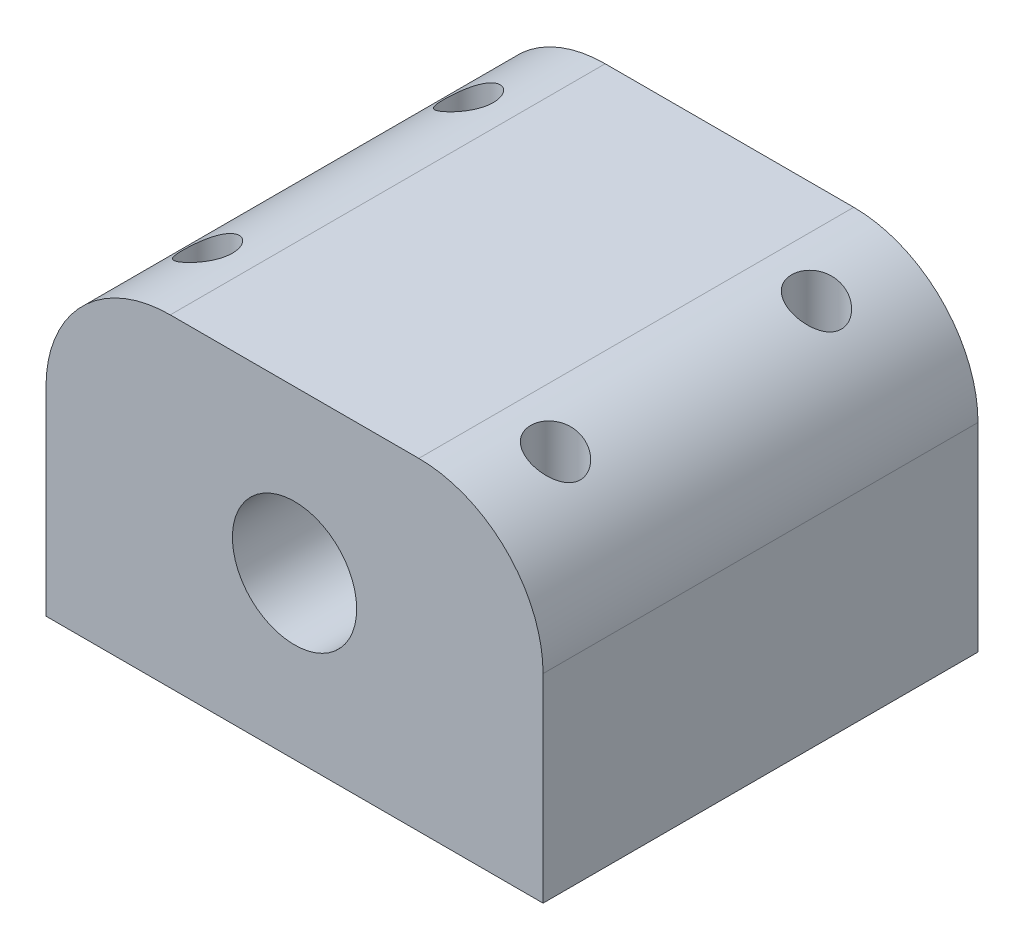
ISO-10303-21;
HEADER;
FILE_DESCRIPTION(('STEP AP214'),'2;1');
FILE_NAME('part.step','',(''),(''),'','','');
FILE_SCHEMA(('AUTOMOTIVE_DESIGN { 1 0 10303 214 1 1 1 1 }'));
ENDSEC;
DATA;
#1=APPLICATION_CONTEXT('core data for automotive mechanical design processes');
#2=APPLICATION_PROTOCOL_DEFINITION('international standard','automotive_design',2000,#1);
#3=PRODUCT_CONTEXT('',#1,'mechanical');
#4=PRODUCT('Part','Part','',(#3));
#5=PRODUCT_RELATED_PRODUCT_CATEGORY('part','',(#4));
#6=PRODUCT_DEFINITION_FORMATION('','',#4);
#7=PRODUCT_DEFINITION_CONTEXT('part definition',#1,'design');
#8=PRODUCT_DEFINITION('design','',#6,#7);
#9=PRODUCT_DEFINITION_SHAPE('','',#8);
#10=(LENGTH_UNIT() NAMED_UNIT(*) SI_UNIT(.MILLI.,.METRE.));
#11=(NAMED_UNIT(*) PLANE_ANGLE_UNIT() SI_UNIT($,.RADIAN.));
#12=(NAMED_UNIT(*) SI_UNIT($,.STERADIAN.) SOLID_ANGLE_UNIT());
#13=UNCERTAINTY_MEASURE_WITH_UNIT(LENGTH_MEASURE(1.E-05),#10,'distance_accuracy_value','');
#14=(GEOMETRIC_REPRESENTATION_CONTEXT(3) GLOBAL_UNCERTAINTY_ASSIGNED_CONTEXT((#13)) GLOBAL_UNIT_ASSIGNED_CONTEXT((#10,
#11,#12)) REPRESENTATION_CONTEXT('',''));
#15=CARTESIAN_POINT('',(0.,0.,0.));
#16=DIRECTION('',(0.,0.,1.));
#17=DIRECTION('',(1.,0.,0.));
#18=AXIS2_PLACEMENT_3D('',#15,#16,#17);
#19=CARTESIAN_POINT('',(30.325,21.8,35.));
#20=DIRECTION('',(1.,0.,0.));
#21=DIRECTION('',(0.,1.,0.));
#22=AXIS2_PLACEMENT_3D('',#19,#20,#21);
#23=PLANE('',#22);
#24=DIRECTION('',(0.,-1.,0.));
#25=VECTOR('',#24,1.);
#26=CARTESIAN_POINT('',(30.325,21.8,0.));
#27=LINE('',#26,#25);
#28=CARTESIAN_POINT('',(30.325,11.8,0.));
#29=VERTEX_POINT('',#28);
#30=CARTESIAN_POINT('',(30.325,-4.19999999999999,0.));
#31=VERTEX_POINT('',#30);
#32=EDGE_CURVE('E119',#29,#31,#27,.T.);
#33=ORIENTED_EDGE('',*,*,#32,.F.);
#34=DIRECTION('',(0.,0.,-1.));
#35=VECTOR('',#34,1.);
#36=CARTESIAN_POINT('',(30.325,11.8,35.));
#37=LINE('',#36,#35);
#38=CARTESIAN_POINT('',(30.325,11.8,35.));
#39=VERTEX_POINT('',#38);
#40=EDGE_CURVE('E11',#29,#39,#37,.F.);
#41=ORIENTED_EDGE('',*,*,#40,.T.);
#42=DIRECTION('',(0.,-1.,0.));
#43=VECTOR('',#42,1.);
#44=CARTESIAN_POINT('',(30.325,21.8,35.));
#45=LINE('',#44,#43);
#46=CARTESIAN_POINT('',(30.325,-4.19999999999999,35.));
#47=VERTEX_POINT('',#46);
#48=EDGE_CURVE('E91',#39,#47,#45,.T.);
#49=ORIENTED_EDGE('',*,*,#48,.T.);
#50=DIRECTION('',(0.,0.,-1.));
#51=VECTOR('',#50,1.);
#52=CARTESIAN_POINT('',(30.325,-4.19999999999999,35.));
#53=LINE('',#52,#51);
#54=EDGE_CURVE('E93',#47,#31,#53,.T.);
#55=ORIENTED_EDGE('',*,*,#54,.T.);
#56=EDGE_LOOP('',(#33,#41,#49,#55));
#57=FACE_BOUND('',#56,.T.);
#58=ADVANCED_FACE('F32',(#57),#23,.T.);
#59=CARTESIAN_POINT('',(30.325,21.8,35.));
#60=DIRECTION('',(0.,-1.,0.));
#61=DIRECTION('',(1.,0.,0.));
#62=AXIS2_PLACEMENT_3D('',#59,#60,#61);
#63=PLANE('',#62);
#64=DIRECTION('',(-1.,0.,0.));
#65=VECTOR('',#64,1.);
#66=CARTESIAN_POINT('',(30.325,21.8,0.));
#67=LINE('',#66,#65);
#68=CARTESIAN_POINT('',(20.325,21.8,0.));
#69=VERTEX_POINT('',#68);
#70=CARTESIAN_POINT('',(0.324999999999999,21.8,0.));
#71=VERTEX_POINT('',#70);
#72=EDGE_CURVE('E99',#69,#71,#67,.T.);
#73=ORIENTED_EDGE('',*,*,#72,.T.);
#74=DIRECTION('',(0.,0.,-1.));
#75=VECTOR('',#74,1.);
#76=CARTESIAN_POINT('',(0.324999999999999,21.8,35.));
#77=LINE('',#76,#75);
#78=CARTESIAN_POINT('',(0.324999999999999,21.8,35.));
#79=VERTEX_POINT('',#78);
#80=EDGE_CURVE('E60',#71,#79,#77,.F.);
#81=ORIENTED_EDGE('',*,*,#80,.T.);
#82=DIRECTION('',(-1.,0.,0.));
#83=VECTOR('',#82,1.);
#84=CARTESIAN_POINT('',(30.325,21.8,35.));
#85=LINE('',#84,#83);
#86=CARTESIAN_POINT('',(20.325,21.8,35.));
#87=VERTEX_POINT('',#86);
#88=EDGE_CURVE('E108',#87,#79,#85,.T.);
#89=ORIENTED_EDGE('',*,*,#88,.F.);
#90=DIRECTION('',(0.,0.,-1.));
#91=VECTOR('',#90,1.);
#92=CARTESIAN_POINT('',(20.325,21.8,0.));
#93=LINE('',#92,#91);
#94=EDGE_CURVE('E137',#87,#69,#93,.T.);
#95=ORIENTED_EDGE('',*,*,#94,.T.);
#96=EDGE_LOOP('',(#73,#81,#89,#95));
#97=FACE_BOUND('',#96,.T.);
#98=ADVANCED_FACE('F178',(#97),#63,.F.);
#99=CARTESIAN_POINT('',(-9.675,21.8,35.));
#100=DIRECTION('',(1.,0.,0.));
#101=DIRECTION('',(0.,0.,-1.));
#102=AXIS2_PLACEMENT_3D('',#99,#100,#101);
#103=PLANE('',#102);
#104=DIRECTION('',(0.,-1.,0.));
#105=VECTOR('',#104,1.);
#106=CARTESIAN_POINT('',(-9.675,21.8,35.));
#107=LINE('',#106,#105);
#108=CARTESIAN_POINT('',(-9.675,11.8,35.));
#109=VERTEX_POINT('',#108);
#110=CARTESIAN_POINT('',(-9.675,-4.2,35.));
#111=VERTEX_POINT('',#110);
#112=EDGE_CURVE('E112',#109,#111,#107,.T.);
#113=ORIENTED_EDGE('',*,*,#112,.F.);
#114=DIRECTION('',(0.,0.,-1.));
#115=VECTOR('',#114,1.);
#116=CARTESIAN_POINT('',(-9.675,11.8,35.));
#117=LINE('',#116,#115);
#118=CARTESIAN_POINT('',(-9.675,11.8,0.));
#119=VERTEX_POINT('',#118);
#120=EDGE_CURVE('E126',#109,#119,#117,.T.);
#121=ORIENTED_EDGE('',*,*,#120,.T.);
#122=DIRECTION('',(0.,-1.,0.));
#123=VECTOR('',#122,1.);
#124=CARTESIAN_POINT('',(-9.675,21.8,0.));
#125=LINE('',#124,#123);
#126=CARTESIAN_POINT('',(-9.675,-4.2,0.));
#127=VERTEX_POINT('',#126);
#128=EDGE_CURVE('E123',#119,#127,#125,.T.);
#129=ORIENTED_EDGE('',*,*,#128,.T.);
#130=DIRECTION('',(0.,0.,-1.));
#131=VECTOR('',#130,1.);
#132=CARTESIAN_POINT('',(-9.675,-4.2,35.));
#133=LINE('',#132,#131);
#134=EDGE_CURVE('E107',#111,#127,#133,.T.);
#135=ORIENTED_EDGE('',*,*,#134,.F.);
#136=EDGE_LOOP('',(#113,#121,#129,#135));
#137=FACE_BOUND('',#136,.T.);
#138=ADVANCED_FACE('F181',(#137),#103,.F.);
#139=CARTESIAN_POINT('',(30.325,-4.19999999999999,35.));
#140=DIRECTION('',(0.,-1.,0.));
#141=DIRECTION('',(1.,0.,0.));
#142=AXIS2_PLACEMENT_3D('',#139,#140,#141);
#143=PLANE('',#142);
#144=CARTESIAN_POINT('',(24.325,-4.2,7.));
#145=DIRECTION('',(0.,1.,0.));
#146=DIRECTION('',(-1.,0.,0.));
#147=AXIS2_PLACEMENT_3D('',#144,#145,#146);
#148=CIRCLE('',#147,2.);
#149=CARTESIAN_POINT('',(22.325,-4.2,7.));
#150=VERTEX_POINT('',#149);
#151=EDGE_CURVE('E290',#150,#150,#148,.T.);
#152=ORIENTED_EDGE('',*,*,#151,.T.);
#153=EDGE_LOOP('',(#152));
#154=FACE_BOUND('',#153,.T.);
#155=CARTESIAN_POINT('',(-3.675,-4.2,28.));
#156=DIRECTION('',(0.,1.,0.));
#157=DIRECTION('',(-1.,0.,0.));
#158=AXIS2_PLACEMENT_3D('',#155,#156,#157);
#159=CIRCLE('',#158,2.);
#160=CARTESIAN_POINT('',(-5.675,-4.2,28.));
#161=VERTEX_POINT('',#160);
#162=EDGE_CURVE('E293',#161,#161,#159,.T.);
#163=ORIENTED_EDGE('',*,*,#162,.T.);
#164=EDGE_LOOP('',(#163));
#165=FACE_BOUND('',#164,.T.);
#166=CARTESIAN_POINT('',(24.325,-4.2,28.));
#167=DIRECTION('',(0.,1.,0.));
#168=DIRECTION('',(-1.,0.,0.));
#169=AXIS2_PLACEMENT_3D('',#166,#167,#168);
#170=CIRCLE('',#169,2.);
#171=CARTESIAN_POINT('',(22.325,-4.2,28.));
#172=VERTEX_POINT('',#171);
#173=EDGE_CURVE('E297',#172,#172,#170,.T.);
#174=ORIENTED_EDGE('',*,*,#173,.T.);
#175=EDGE_LOOP('',(#174));
#176=FACE_BOUND('',#175,.T.);
#177=CARTESIAN_POINT('',(-3.675,-4.2,7.));
#178=DIRECTION('',(0.,1.,0.));
#179=DIRECTION('',(-1.,0.,0.));
#180=AXIS2_PLACEMENT_3D('',#177,#178,#179);
#181=CIRCLE('',#180,2.);
#182=CARTESIAN_POINT('',(-5.675,-4.2,7.));
#183=VERTEX_POINT('',#182);
#184=EDGE_CURVE('E151',#183,#183,#181,.T.);
#185=ORIENTED_EDGE('',*,*,#184,.T.);
#186=EDGE_LOOP('',(#185));
#187=FACE_BOUND('',#186,.T.);
#188=DIRECTION('',(-1.,0.,0.));
#189=VECTOR('',#188,1.);
#190=CARTESIAN_POINT('',(30.325,-4.19999999999999,0.));
#191=LINE('',#190,#189);
#192=EDGE_CURVE('E106',#31,#127,#191,.T.);
#193=ORIENTED_EDGE('',*,*,#192,.F.);
#194=ORIENTED_EDGE('',*,*,#54,.F.);
#195=DIRECTION('',(-1.,0.,0.));
#196=VECTOR('',#195,1.);
#197=CARTESIAN_POINT('',(30.325,-4.19999999999999,35.));
#198=LINE('',#197,#196);
#199=EDGE_CURVE('E98',#47,#111,#198,.T.);
#200=ORIENTED_EDGE('',*,*,#199,.T.);
#201=ORIENTED_EDGE('',*,*,#134,.T.);
#202=EDGE_LOOP('',(#193,#194,#200,#201));
#203=FACE_BOUND('',#202,.T.);
#204=ADVANCED_FACE('F103',(#154,#165,#176,#187,#203),#143,.T.);
#205=CARTESIAN_POINT('',(0.,0.,35.));
#206=DIRECTION('',(0.,0.,-1.));
#207=DIRECTION('',(-1.,0.,0.));
#208=AXIS2_PLACEMENT_3D('',#205,#206,#207);
#209=PLANE('',#208);
#210=CARTESIAN_POINT('',(10.325,8.8,35.));
#211=DIRECTION('',(0.,0.,1.));
#212=DIRECTION('',(1.,0.,0.));
#213=AXIS2_PLACEMENT_3D('',#210,#211,#212);
#214=CIRCLE('',#213,5.);
#215=CARTESIAN_POINT('',(15.325,8.8,35.));
#216=VERTEX_POINT('',#215);
#217=EDGE_CURVE('E130',#216,#216,#214,.T.);
#218=ORIENTED_EDGE('',*,*,#217,.F.);
#219=EDGE_LOOP('',(#218));
#220=FACE_BOUND('',#219,.T.);
#221=ORIENTED_EDGE('',*,*,#88,.T.);
#222=CARTESIAN_POINT('',(0.324999999999999,11.8,35.));
#223=DIRECTION('',(0.,0.,-1.));
#224=DIRECTION('',(-1.,0.,0.));
#225=AXIS2_PLACEMENT_3D('',#222,#223,#224);
#226=CIRCLE('',#225,10.);
#227=EDGE_CURVE('E46',#79,#109,#226,.F.);
#228=ORIENTED_EDGE('',*,*,#227,.T.);
#229=ORIENTED_EDGE('',*,*,#112,.T.);
#230=ORIENTED_EDGE('',*,*,#199,.F.);
#231=ORIENTED_EDGE('',*,*,#48,.F.);
#232=CARTESIAN_POINT('',(20.325,11.8,35.));
#233=DIRECTION('',(0.,0.,-1.));
#234=DIRECTION('',(-1.,0.,0.));
#235=AXIS2_PLACEMENT_3D('',#232,#233,#234);
#236=CIRCLE('',#235,10.);
#237=EDGE_CURVE('E141',#39,#87,#236,.F.);
#238=ORIENTED_EDGE('',*,*,#237,.T.);
#239=EDGE_LOOP('',(#221,#228,#229,#230,#231,#238));
#240=FACE_BOUND('',#239,.T.);
#241=ADVANCED_FACE('F110',(#220,#240),#209,.F.);
#242=CARTESIAN_POINT('',(0.,0.,0.));
#243=DIRECTION('',(0.,0.,-1.));
#244=DIRECTION('',(-1.,0.,0.));
#245=AXIS2_PLACEMENT_3D('',#242,#243,#244);
#246=PLANE('',#245);
#247=CARTESIAN_POINT('',(10.325,8.8,0.));
#248=DIRECTION('',(0.,0.,-1.));
#249=DIRECTION('',(-1.,0.,0.));
#250=AXIS2_PLACEMENT_3D('',#247,#248,#249);
#251=CIRCLE('',#250,5.);
#252=CARTESIAN_POINT('',(15.325,8.8,0.));
#253=VERTEX_POINT('',#252);
#254=EDGE_CURVE('E121',#253,#253,#251,.T.);
#255=ORIENTED_EDGE('',*,*,#254,.F.);
#256=EDGE_LOOP('',(#255));
#257=FACE_BOUND('',#256,.T.);
#258=ORIENTED_EDGE('',*,*,#128,.F.);
#259=CARTESIAN_POINT('',(0.324999999999999,11.8,0.));
#260=DIRECTION('',(0.,0.,-1.));
#261=DIRECTION('',(-1.,0.,0.));
#262=AXIS2_PLACEMENT_3D('',#259,#260,#261);
#263=CIRCLE('',#262,10.);
#264=EDGE_CURVE('E135',#119,#71,#263,.T.);
#265=ORIENTED_EDGE('',*,*,#264,.T.);
#266=ORIENTED_EDGE('',*,*,#72,.F.);
#267=CARTESIAN_POINT('',(20.325,11.8,0.));
#268=DIRECTION('',(0.,0.,-1.));
#269=DIRECTION('',(-1.,0.,0.));
#270=AXIS2_PLACEMENT_3D('',#267,#268,#269);
#271=CIRCLE('',#270,10.);
#272=EDGE_CURVE('E133',#69,#29,#271,.T.);
#273=ORIENTED_EDGE('',*,*,#272,.T.);
#274=ORIENTED_EDGE('',*,*,#32,.T.);
#275=ORIENTED_EDGE('',*,*,#192,.T.);
#276=EDGE_LOOP('',(#258,#265,#266,#273,#274,#275));
#277=FACE_BOUND('',#276,.T.);
#278=ADVANCED_FACE('F170',(#257,#277),#246,.T.);
#279=CARTESIAN_POINT('',(10.325,8.8,-9.99999999999999));
#280=DIRECTION('',(0.,0.,1.));
#281=DIRECTION('',(1.,0.,0.));
#282=AXIS2_PLACEMENT_3D('',#279,#280,#281);
#283=CYLINDRICAL_SURFACE('',#282,5.);
#284=CARTESIAN_POINT('',(15.325,8.8,0.));
#285=CARTESIAN_POINT('',(15.325,8.8,0.364583333333335));
#286=CARTESIAN_POINT('',(15.325,8.8,0.729166666666669));
#287=CARTESIAN_POINT('',(15.325,8.8,1.45833333333334));
#288=CARTESIAN_POINT('',(15.325,8.8,1.82291666666667));
#289=CARTESIAN_POINT('',(15.325,8.8,2.55208333333333));
#290=CARTESIAN_POINT('',(15.325,8.8,2.91666666666667));
#291=CARTESIAN_POINT('',(15.325,8.8,3.64583333333333));
#292=CARTESIAN_POINT('',(15.325,8.8,4.01041666666667));
#293=CARTESIAN_POINT('',(15.325,8.8,4.73958333333334));
#294=CARTESIAN_POINT('',(15.325,8.8,5.10416666666667));
#295=CARTESIAN_POINT('',(15.325,8.8,5.83333333333334));
#296=CARTESIAN_POINT('',(15.325,8.8,6.19791666666667));
#297=CARTESIAN_POINT('',(15.325,8.8,6.92708333333333));
#298=CARTESIAN_POINT('',(15.325,8.8,7.29166666666667));
#299=CARTESIAN_POINT('',(15.325,8.8,8.02083333333333));
#300=CARTESIAN_POINT('',(15.325,8.8,8.38541666666667));
#301=CARTESIAN_POINT('',(15.325,8.8,9.11458333333333));
#302=CARTESIAN_POINT('',(15.325,8.8,9.47916666666667));
#303=CARTESIAN_POINT('',(15.325,8.8,10.2083333333333));
#304=CARTESIAN_POINT('',(15.325,8.8,10.5729166666667));
#305=CARTESIAN_POINT('',(15.325,8.8,11.3020833333333));
#306=CARTESIAN_POINT('',(15.325,8.8,11.6666666666667));
#307=CARTESIAN_POINT('',(15.325,8.8,12.3958333333333));
#308=CARTESIAN_POINT('',(15.325,8.8,12.7604166666667));
#309=CARTESIAN_POINT('',(15.325,8.8,13.4895833333333));
#310=CARTESIAN_POINT('',(15.325,8.8,13.8541666666667));
#311=CARTESIAN_POINT('',(15.325,8.8,14.5833333333333));
#312=CARTESIAN_POINT('',(15.325,8.8,14.9479166666667));
#313=CARTESIAN_POINT('',(15.325,8.8,15.6770833333333));
#314=CARTESIAN_POINT('',(15.325,8.8,16.0416666666667));
#315=CARTESIAN_POINT('',(15.325,8.8,16.7708333333333));
#316=CARTESIAN_POINT('',(15.325,8.8,17.1354166666667));
#317=CARTESIAN_POINT('',(15.325,8.8,17.8645833333333));
#318=CARTESIAN_POINT('',(15.325,8.8,18.2291666666667));
#319=CARTESIAN_POINT('',(15.325,8.8,18.9583333333333));
#320=CARTESIAN_POINT('',(15.325,8.8,19.3229166666667));
#321=CARTESIAN_POINT('',(15.325,8.8,20.0520833333333));
#322=CARTESIAN_POINT('',(15.325,8.8,20.4166666666667));
#323=CARTESIAN_POINT('',(15.325,8.8,21.1458333333333));
#324=CARTESIAN_POINT('',(15.325,8.8,21.5104166666667));
#325=CARTESIAN_POINT('',(15.325,8.8,22.2395833333333));
#326=CARTESIAN_POINT('',(15.325,8.8,22.6041666666667));
#327=CARTESIAN_POINT('',(15.325,8.8,23.3333333333333));
#328=CARTESIAN_POINT('',(15.325,8.8,23.6979166666667));
#329=CARTESIAN_POINT('',(15.325,8.8,24.4270833333333));
#330=CARTESIAN_POINT('',(15.325,8.8,24.7916666666667));
#331=CARTESIAN_POINT('',(15.325,8.8,25.5208333333333));
#332=CARTESIAN_POINT('',(15.325,8.8,25.8854166666667));
#333=CARTESIAN_POINT('',(15.325,8.8,26.6145833333333));
#334=CARTESIAN_POINT('',(15.325,8.8,26.9791666666667));
#335=CARTESIAN_POINT('',(15.325,8.8,27.7083333333333));
#336=CARTESIAN_POINT('',(15.325,8.8,28.0729166666667));
#337=CARTESIAN_POINT('',(15.325,8.8,28.8020833333333));
#338=CARTESIAN_POINT('',(15.325,8.8,29.1666666666667));
#339=CARTESIAN_POINT('',(15.325,8.8,29.8958333333333));
#340=CARTESIAN_POINT('',(15.325,8.8,30.2604166666667));
#341=CARTESIAN_POINT('',(15.325,8.8,30.9895833333333));
#342=CARTESIAN_POINT('',(15.325,8.8,31.3541666666667));
#343=CARTESIAN_POINT('',(15.325,8.8,32.0833333333333));
#344=CARTESIAN_POINT('',(15.325,8.8,32.4479166666667));
#345=CARTESIAN_POINT('',(15.325,8.8,33.1770833333333));
#346=CARTESIAN_POINT('',(15.325,8.8,33.5416666666667));
#347=CARTESIAN_POINT('',(15.325,8.8,34.2708333333333));
#348=CARTESIAN_POINT('',(15.325,8.8,34.6354166666667));
#349=CARTESIAN_POINT('',(15.325,8.8,35.));
#350=B_SPLINE_CURVE_WITH_KNOTS('',3,(#284,#285,#286,#287,#288,#289,#290,#291,#292,#293,#294,
#295,#296,#297,#298,#299,#300,#301,#302,#303,#304,#305,#306,#307,#308,#309,#310,#311,#312,#313,
#314,#315,#316,#317,#318,#319,#320,#321,#322,#323,#324,#325,#326,#327,#328,#329,#330,#331,#332,
#333,#334,#335,#336,#337,#338,#339,#340,#341,#342,#343,#344,#345,#346,#347,#348,#349),
.UNSPECIFIED.,.F.,.F.,(4,2,2,2,2,2,2,2,2,2,2,2,2,2,2,2,2,2,2,2,2,2,2,2,2,2,2,2,2,2,2,2,4),(0.,
1.09375,2.1875,3.28125,4.375,5.46875,6.5625,7.65625,8.75,9.84375,10.9375,12.03125,13.125,
14.21875,15.3125,16.40625,17.5,18.59375,19.6875,20.78125,21.875,22.96875,24.0625,25.15625,26.25,
27.34375,28.4375,29.53125,30.625,31.71875,32.8125,33.90625,35.),.UNSPECIFIED.);
#351=EDGE_CURVE('BSEAM167',#253,#216,#350,.T.);
#352=ORIENTED_EDGE('',*,*,#254,.T.);
#353=ORIENTED_EDGE('',*,*,#217,.T.);
#354=ORIENTED_EDGE('',*,*,#351,.T.);
#355=ORIENTED_EDGE('',*,*,#351,.F.);
#356=EDGE_LOOP('',(#352,#354,#353,#355));
#357=FACE_BOUND('',#356,.T.);
#358=ADVANCED_FACE('F167',(#357),#283,.F.);
#359=CARTESIAN_POINT('',(0.324999999999999,11.8,35.));
#360=DIRECTION('',(0.,0.,-1.));
#361=DIRECTION('',(-1.,0.,0.));
#362=AXIS2_PLACEMENT_3D('',#359,#360,#361);
#363=CYLINDRICAL_SURFACE('',#362,10.);
#364=CARTESIAN_POINT('',(-5.675,19.8,28.));
#365=CARTESIAN_POINT('',(-5.6749992352671,19.8000008450191,28.0978474679321));
#366=CARTESIAN_POINT('',(-5.66777519863334,19.8054339424753,28.1957008338732));
#367=CARTESIAN_POINT('',(-5.63937574387624,19.8266133791742,28.388213913058));
#368=CARTESIAN_POINT('',(-5.61819286934274,19.8423652303722,28.4828718909931));
#369=CARTESIAN_POINT('',(-5.56330742531324,19.8826340246115,28.6658690044728));
#370=CARTESIAN_POINT('',(-5.52967204142541,19.9071039046519,28.7542390694192));
#371=CARTESIAN_POINT('',(-5.45144329358742,19.9630268895351,28.923557530525));
#372=CARTESIAN_POINT('',(-5.4068464406304,19.9944822175194,29.0045035523441));
#373=CARTESIAN_POINT('',(-5.30370379947496,20.0657099552383,29.1650060791315));
#374=CARTESIAN_POINT('',(-5.24425495305186,20.1059800732674,29.2437574443349));
#375=CARTESIAN_POINT('',(-5.11583675141053,20.1906627230818,29.3905067682152));
#376=CARTESIAN_POINT('',(-5.04686272425366,20.2350772841574,29.4584994145907));
#377=CARTESIAN_POINT('',(-4.88712295715575,20.3348814320873,29.5949150310958));
#378=CARTESIAN_POINT('',(-4.79469506188485,20.3907688928121,29.6610349750229));
#379=CARTESIAN_POINT('',(-4.60047073631427,20.5035840617867,29.7765945678726));
#380=CARTESIAN_POINT('',(-4.49866788935992,20.5605124608211,29.8260226824994));
#381=CARTESIAN_POINT('',(-4.27671528546498,20.6792806053411,29.9114120582432));
#382=CARTESIAN_POINT('',(-4.15575813787511,20.7410164059829,29.945441625655));
#383=CARTESIAN_POINT('',(-3.90790876169264,20.860983737464,29.9903784364652));
#384=CARTESIAN_POINT('',(-3.78101683697031,20.91921544737,30.0012868623821));
#385=CARTESIAN_POINT('',(-3.5279652542469,21.0289347160919,29.9985039254274));
#386=CARTESIAN_POINT('',(-3.40185449542301,21.0805454712849,29.9853660057851));
#387=CARTESIAN_POINT('',(-3.1519896054365,21.1770168081407,29.9346002990847));
#388=CARTESIAN_POINT('',(-3.02823396742739,21.2218818419837,29.8969887527563));
#389=CARTESIAN_POINT('',(-2.79907960960714,21.3001828418253,29.8018708596972));
#390=CARTESIAN_POINT('',(-2.69303311180113,21.33428562815,29.7464726008552));
#391=CARTESIAN_POINT('',(-2.49124649975612,21.3958262753458,29.6165104825004));
#392=CARTESIAN_POINT('',(-2.39550168039748,21.423267186174,29.5419554257058));
#393=CARTESIAN_POINT('',(-2.22483945665329,21.4698286063448,29.3819189365829));
#394=CARTESIAN_POINT('',(-2.14890520334706,21.4894145070522,29.2976540518763));
#395=CARTESIAN_POINT('',(-2.01199758225605,21.5233445551251,29.1168146185409));
#396=CARTESIAN_POINT('',(-1.95102130818913,21.5376897210121,29.02024246672));
#397=CARTESIAN_POINT('',(-1.84787152776972,21.5612167736483,28.8208578367488));
#398=CARTESIAN_POINT('',(-1.80516744148862,21.5705467270643,28.7183367621209));
#399=CARTESIAN_POINT('',(-1.73725823940412,21.5851063412377,28.5073784595884));
#400=CARTESIAN_POINT('',(-1.71205222820419,21.5903362118029,28.3989415347109));
#401=CARTESIAN_POINT('',(-1.68007526499069,21.5969353003909,28.1800626255089));
#402=CARTESIAN_POINT('',(-1.6731742122069,21.5983317664689,28.0696404381064));
#403=CARTESIAN_POINT('',(-1.67764958822005,21.59741800062,27.84918244206));
#404=CARTESIAN_POINT('',(-1.68902582923406,21.5951078067755,27.7391466294581));
#405=CARTESIAN_POINT('',(-1.72968111723186,21.5866598302623,27.5226562884118));
#406=CARTESIAN_POINT('',(-1.75894910382679,21.5805244122389,27.4161995902762));
#407=CARTESIAN_POINT('',(-1.8344342810985,21.564134639989,27.2098165643333));
#408=CARTESIAN_POINT('',(-1.88065102101914,21.553880395303,27.1098900629372));
#409=CARTESIAN_POINT('',(-1.9885535737519,21.5288501580225,26.9193072195746));
#410=CARTESIAN_POINT('',(-2.0502496732424,21.5140711570949,26.8286570987719));
#411=CARTESIAN_POINT('',(-2.18703096260043,21.479600181968,26.6591768716822));
#412=CARTESIAN_POINT('',(-2.26211582250567,21.4599083288397,26.5803464741894));
#413=CARTESIAN_POINT('',(-2.42374700880594,21.4151680127964,26.4359689316623));
#414=CARTESIAN_POINT('',(-2.51037242911493,21.3900817764359,26.3705221571451));
#415=CARTESIAN_POINT('',(-2.69178339388402,21.3345691284124,26.2550496849523));
#416=CARTESIAN_POINT('',(-2.78656964042327,21.3041422570579,26.2050253157716));
#417=CARTESIAN_POINT('',(-2.98417393565074,21.2371898007704,26.1199292872387));
#418=CARTESIAN_POINT('',(-3.08714534012979,21.2005126872761,26.0853343775181));
#419=CARTESIAN_POINT('',(-3.29552228470116,21.1222431484749,26.0333941705954));
#420=CARTESIAN_POINT('',(-3.4009284825914,21.080649382059,26.0160535920385));
#421=CARTESIAN_POINT('',(-3.61824275591897,20.9905136915871,25.9976450012967));
#422=CARTESIAN_POINT('',(-3.73013084279529,20.9416964646093,25.9977009075984));
#423=CARTESIAN_POINT('',(-3.95078969703642,20.8405961019494,26.0160111440568));
#424=CARTESIAN_POINT('',(-4.05955939885171,20.7883118013209,26.0342716202188));
#425=CARTESIAN_POINT('',(-4.28112936127325,20.6769512512387,26.0903406673723));
#426=CARTESIAN_POINT('',(-4.39343223764616,20.6176837709341,26.1297385550997));
#427=CARTESIAN_POINT('',(-4.60926380859232,20.4987502008711,26.2276530655848));
#428=CARTESIAN_POINT('',(-4.71278449232488,20.4390837996195,26.2861869123331));
#429=CARTESIAN_POINT('',(-4.91438593467616,20.318416338472,26.425265719301));
#430=CARTESIAN_POINT('',(-5.01179837623275,20.2575400472874,26.5068943821725));
#431=CARTESIAN_POINT('',(-5.1910215007674,20.1417546032806,26.6892834317765));
#432=CARTESIAN_POINT('',(-5.27285194806905,20.0868379297972,26.7900192545221));
#433=CARTESIAN_POINT('',(-5.39883461385682,20.0001231688497,26.9811912974575));
#434=CARTESIAN_POINT('',(-5.44727831880467,19.9659952396854,27.0677507532405));
#435=CARTESIAN_POINT('',(-5.53150165572695,19.9058047926481,27.2494076104906));
#436=CARTESIAN_POINT('',(-5.5672976023887,19.8797318898748,27.3444938129828));
#437=CARTESIAN_POINT('',(-5.62168921739865,19.8397718025706,27.5319981236106));
#438=CARTESIAN_POINT('',(-5.64157188341503,19.8249789587545,27.6238462669851));
#439=CARTESIAN_POINT('',(-5.66822516830574,19.8050944807129,27.810461840298));
#440=CARTESIAN_POINT('',(-5.67500074069519,19.7999991815422,27.9052281536218));
#441=CARTESIAN_POINT('',(-5.675,19.8,28.));
#442=B_SPLINE_CURVE_WITH_KNOTS('',3,(#364,#365,#366,#367,#368,#369,#370,#371,#372,#373,#374,
#375,#376,#377,#378,#379,#380,#381,#382,#383,#384,#385,#386,#387,#388,#389,#390,#391,#392,#393,
#394,#395,#396,#397,#398,#399,#400,#401,#402,#403,#404,#405,#406,#407,#408,#409,#410,#411,#412,
#413,#414,#415,#416,#417,#418,#419,#420,#421,#422,#423,#424,#425,#426,#427,#428,#429,#430,#431,
#432,#433,#434,#435,#436,#437,#438,#439,#440,#441),.UNSPECIFIED.,.T.,.F.,(4,2,2,2,2,2,2,2,2,2,2,
2,2,2,2,2,2,2,2,2,2,2,2,2,2,2,2,2,2,2,2,2,2,2,2,2,2,2,4),(0.,0.293154572841918,
0.586465867511269,0.878217176340485,1.17006146937849,1.48861489391431,1.80732512210561,
2.1857088483938,2.56435351083554,2.98232181786989,3.40026874762329,3.80871702851097,
4.21689453864583,4.58813870274976,4.95921258099959,5.30283151516154,5.64638363241257,
5.97914148568273,6.31188231009704,6.6422517933583,6.97261788238866,7.30277995065984,
7.63293323882882,7.96330651141903,8.29367164317685,8.62643016825777,8.95921734934826,
9.30167493694768,9.64422615275396,10.0089125734003,10.3737221567438,10.7708695144879,
11.168375327374,11.5890401528583,12.0091677967257,12.322646861316,12.6357200716689,
12.9197673403842,13.203707239184),.UNSPECIFIED.);
#443=CARTESIAN_POINT('',(-5.675,19.8,28.));
#444=VERTEX_POINT('',#443);
#445=EDGE_CURVE('E37',#444,#444,#442,.T.);
#446=ORIENTED_EDGE('',*,*,#445,.F.);
#447=EDGE_LOOP('',(#446));
#448=FACE_BOUND('',#447,.T.);
#449=CARTESIAN_POINT('',(-5.675,19.8,7.));
#450=CARTESIAN_POINT('',(-5.6749992352671,19.8000008450191,7.09784746793205));
#451=CARTESIAN_POINT('',(-5.66777519863334,19.8054339424753,7.19570083387318));
#452=CARTESIAN_POINT('',(-5.63937574387625,19.8266133791742,7.38821391305803));
#453=CARTESIAN_POINT('',(-5.61819286934274,19.8423652303722,7.48287189099314));
#454=CARTESIAN_POINT('',(-5.56330742531325,19.8826340246115,7.6658690044728));
#455=CARTESIAN_POINT('',(-5.52967204142541,19.9071039046519,7.7542390694192));
#456=CARTESIAN_POINT('',(-5.45144329358742,19.9630268895351,7.92355753052495));
#457=CARTESIAN_POINT('',(-5.4068464406304,19.9944822175194,8.00450355234413));
#458=CARTESIAN_POINT('',(-5.30370379947496,20.0657099552383,8.16500607913151));
#459=CARTESIAN_POINT('',(-5.24425495305186,20.1059800732674,8.24375744433485));
#460=CARTESIAN_POINT('',(-5.11583675141053,20.1906627230818,8.39050676821521));
#461=CARTESIAN_POINT('',(-5.04686272425366,20.2350772841574,8.45849941459073));
#462=CARTESIAN_POINT('',(-4.88712295715575,20.3348814320873,8.59491503109582));
#463=CARTESIAN_POINT('',(-4.79469506188485,20.3907688928121,8.66103497502289));
#464=CARTESIAN_POINT('',(-4.60047073631427,20.5035840617867,8.77659456787263));
#465=CARTESIAN_POINT('',(-4.49866788935992,20.5605124608211,8.82602268249939));
#466=CARTESIAN_POINT('',(-4.27671528546498,20.6792806053411,8.91141205824319));
#467=CARTESIAN_POINT('',(-4.15575813787511,20.7410164059829,8.94544162565497));
#468=CARTESIAN_POINT('',(-3.90790876169264,20.860983737464,8.99037843646523));
#469=CARTESIAN_POINT('',(-3.7810168369703,20.91921544737,9.00128686238211));
#470=CARTESIAN_POINT('',(-3.5279652542469,21.0289347160919,8.9985039254274));
#471=CARTESIAN_POINT('',(-3.40185449542301,21.0805454712849,8.98536600578508));
#472=CARTESIAN_POINT('',(-3.1519896054365,21.1770168081407,8.9346002990847));
#473=CARTESIAN_POINT('',(-3.02823396742739,21.2218818419837,8.89698875275627));
#474=CARTESIAN_POINT('',(-2.79907960960715,21.3001828418253,8.80187085969717));
#475=CARTESIAN_POINT('',(-2.69303311180113,21.33428562815,8.74647260085515));
#476=CARTESIAN_POINT('',(-2.49124649975612,21.3958262753458,8.61651048250039));
#477=CARTESIAN_POINT('',(-2.39550168039748,21.423267186174,8.54195542570581));
#478=CARTESIAN_POINT('',(-2.22483945665329,21.4698286063448,8.38191893658291));
#479=CARTESIAN_POINT('',(-2.14890520334706,21.4894145070522,8.29765405187627));
#480=CARTESIAN_POINT('',(-2.01199758225605,21.5233445551251,8.1168146185409));
#481=CARTESIAN_POINT('',(-1.95102130818913,21.5376897210121,8.02024246671997));
#482=CARTESIAN_POINT('',(-1.84787152776972,21.5612167736483,7.82085783674878));
#483=CARTESIAN_POINT('',(-1.80516744148862,21.5705467270643,7.71833676212094));
#484=CARTESIAN_POINT('',(-1.73725823940412,21.5851063412377,7.50737845958842));
#485=CARTESIAN_POINT('',(-1.71205222820419,21.5903362118029,7.39894153471089));
#486=CARTESIAN_POINT('',(-1.6800752649907,21.5969353003909,7.18006262550892));
#487=CARTESIAN_POINT('',(-1.6731742122069,21.5983317664689,7.06964043810639));
#488=CARTESIAN_POINT('',(-1.67764958822005,21.59741800062,6.84918244206));
#489=CARTESIAN_POINT('',(-1.68902582923406,21.5951078067755,6.73914662945813));
#490=CARTESIAN_POINT('',(-1.72968111723187,21.5866598302623,6.52265628841176));
#491=CARTESIAN_POINT('',(-1.75894910382679,21.5805244122389,6.41619959027619));
#492=CARTESIAN_POINT('',(-1.8344342810985,21.564134639989,6.20981656433334));
#493=CARTESIAN_POINT('',(-1.88065102101915,21.553880395303,6.10989006293718));
#494=CARTESIAN_POINT('',(-1.9885535737519,21.5288501580225,5.91930721957459));
#495=CARTESIAN_POINT('',(-2.05024967324241,21.5140711570949,5.82865709877191));
#496=CARTESIAN_POINT('',(-2.18703096260043,21.479600181968,5.65917687168217));
#497=CARTESIAN_POINT('',(-2.26211582250567,21.4599083288397,5.58034647418943));
#498=CARTESIAN_POINT('',(-2.42374700880594,21.4151680127964,5.43596893166228));
#499=CARTESIAN_POINT('',(-2.51037242911493,21.3900817764359,5.37052215714514));
#500=CARTESIAN_POINT('',(-2.69178339388402,21.3345691284124,5.25504968495229));
#501=CARTESIAN_POINT('',(-2.78656964042328,21.3041422570579,5.20502531577156));
#502=CARTESIAN_POINT('',(-2.98417393565074,21.2371898007704,5.11992928723869));
#503=CARTESIAN_POINT('',(-3.0871453401298,21.2005126872761,5.08533437751805));
#504=CARTESIAN_POINT('',(-3.29552228470116,21.1222431484749,5.03339417059536));
#505=CARTESIAN_POINT('',(-3.4009284825914,21.080649382059,5.01605359203849));
#506=CARTESIAN_POINT('',(-3.61824275591897,20.9905136915871,4.99764500129674));
#507=CARTESIAN_POINT('',(-3.7301308427953,20.9416964646093,4.99770090759836));
#508=CARTESIAN_POINT('',(-3.95078969703643,20.8405961019494,5.0160111440568));
#509=CARTESIAN_POINT('',(-4.05955939885171,20.7883118013209,5.03427162021881));
#510=CARTESIAN_POINT('',(-4.28112936127325,20.6769512512387,5.09034066737229));
#511=CARTESIAN_POINT('',(-4.39343223764616,20.6176837709341,5.12973855509971));
#512=CARTESIAN_POINT('',(-4.60926380859233,20.4987502008711,5.2276530655848));
#513=CARTESIAN_POINT('',(-4.71278449232488,20.4390837996195,5.28618691233314));
#514=CARTESIAN_POINT('',(-4.91438593467616,20.318416338472,5.42526571930096));
#515=CARTESIAN_POINT('',(-5.01179837623276,20.2575400472874,5.50689438217246));
#516=CARTESIAN_POINT('',(-5.1910215007674,20.1417546032806,5.68928343177651));
#517=CARTESIAN_POINT('',(-5.27285194806905,20.0868379297972,5.79001925452207));
#518=CARTESIAN_POINT('',(-5.39883461385682,20.0001231688497,5.98119129745746));
#519=CARTESIAN_POINT('',(-5.44727831880467,19.9659952396854,6.06775075324053));
#520=CARTESIAN_POINT('',(-5.53150165572696,19.9058047926481,6.24940761049057));
#521=CARTESIAN_POINT('',(-5.5672976023887,19.8797318898748,6.34449381298281));
#522=CARTESIAN_POINT('',(-5.62168921739865,19.8397718025706,6.53199812361056));
#523=CARTESIAN_POINT('',(-5.64157188341503,19.8249789587545,6.62384626698513));
#524=CARTESIAN_POINT('',(-5.66822516830574,19.8050944807129,6.81046184029798));
#525=CARTESIAN_POINT('',(-5.67500074069519,19.7999991815422,6.90522815362181));
#526=CARTESIAN_POINT('',(-5.675,19.8,7.));
#527=B_SPLINE_CURVE_WITH_KNOTS('',3,(#449,#450,#451,#452,#453,#454,#455,#456,#457,#458,#459,
#460,#461,#462,#463,#464,#465,#466,#467,#468,#469,#470,#471,#472,#473,#474,#475,#476,#477,#478,
#479,#480,#481,#482,#483,#484,#485,#486,#487,#488,#489,#490,#491,#492,#493,#494,#495,#496,#497,
#498,#499,#500,#501,#502,#503,#504,#505,#506,#507,#508,#509,#510,#511,#512,#513,#514,#515,#516,
#517,#518,#519,#520,#521,#522,#523,#524,#525,#526),.UNSPECIFIED.,.T.,.F.,(4,2,2,2,2,2,2,2,2,2,2,
2,2,2,2,2,2,2,2,2,2,2,2,2,2,2,2,2,2,2,2,2,2,2,2,2,2,2,4),(0.,0.293154572841919,0.58646586751127,
0.878217176340485,1.17006146937849,1.48861489391431,1.80732512210561,2.1857088483938,
2.56435351083554,2.9823218178699,3.40026874762329,3.80871702851097,4.21689453864583,
4.58813870274976,4.95921258099959,5.30283151516154,5.64638363241257,5.97914148568273,
6.31188231009704,6.6422517933583,6.97261788238866,7.30277995065984,7.63293323882881,
7.96330651141903,8.29367164317685,8.62643016825777,8.95921734934826,9.30167493694768,
9.64422615275396,10.0089125734003,10.3737221567438,10.7708695144879,11.168375327374,
11.5890401528583,12.0091677967257,12.322646861316,12.6357200716689,12.9197673403842,
13.203707239184),.UNSPECIFIED.);
#528=CARTESIAN_POINT('',(-5.675,19.8,7.));
#529=VERTEX_POINT('',#528);
#530=EDGE_CURVE('E144',#529,#529,#527,.T.);
#531=ORIENTED_EDGE('',*,*,#530,.F.);
#532=EDGE_LOOP('',(#531));
#533=FACE_BOUND('',#532,.T.);
#534=ORIENTED_EDGE('',*,*,#227,.F.);
#535=ORIENTED_EDGE('',*,*,#80,.F.);
#536=ORIENTED_EDGE('',*,*,#264,.F.);
#537=ORIENTED_EDGE('',*,*,#120,.F.);
#538=EDGE_LOOP('',(#534,#535,#536,#537));
#539=FACE_BOUND('',#538,.T.);
#540=ADVANCED_FACE('F157',(#448,#533,#539),#363,.T.);
#541=CARTESIAN_POINT('',(20.325,11.8,35.));
#542=DIRECTION('',(0.,0.,1.));
#543=DIRECTION('',(1.,0.,0.));
#544=AXIS2_PLACEMENT_3D('',#541,#542,#543);
#545=CYLINDRICAL_SURFACE('',#544,10.);
#546=CARTESIAN_POINT('',(22.325,21.5979589711327,7.));
#547=CARTESIAN_POINT('',(22.3250003028011,21.597959055196,7.11025356731125));
#548=CARTESIAN_POINT('',(22.3341416743432,21.596106291907,7.22051111225518));
#549=CARTESIAN_POINT('',(22.3704180093525,21.5885955386656,7.43789659621254));
#550=CARTESIAN_POINT('',(22.3975540481222,21.5829373213113,7.54502434780031));
#551=CARTESIAN_POINT('',(22.4689443799653,21.567539424981,7.75309577589527));
#552=CARTESIAN_POINT('',(22.5131974214776,21.5578000444071,7.85403990391173));
#553=CARTESIAN_POINT('',(22.617368233396,21.5338528211826,8.04690246512559));
#554=CARTESIAN_POINT('',(22.6772852326852,21.5196451984908,8.13882134231828));
#555=CARTESIAN_POINT('',(22.81090075725,21.4863321354737,8.31126685980234));
#556=CARTESIAN_POINT('',(22.8846225202944,21.4672184162276,8.39177388287335));
#557=CARTESIAN_POINT('',(23.0432978491294,21.4238042780537,8.53914448600285));
#558=CARTESIAN_POINT('',(23.1282515080496,21.3995038161187,8.60600795292354));
#559=CARTESIAN_POINT('',(23.3078940411219,21.3452218567814,8.72548584366132));
#560=CARTESIAN_POINT('',(23.4027067624405,21.3151627182824,8.77787837676805));
#561=CARTESIAN_POINT('',(23.5979715789439,21.2497755787163,8.86625911653278));
#562=CARTESIAN_POINT('',(23.6984246110884,21.214446700624,8.90224458856643));
#563=CARTESIAN_POINT('',(23.9065133608331,21.1373228035828,8.9588260974709));
#564=CARTESIAN_POINT('',(24.0142707929573,21.0953119840495,8.97867705882831));
#565=CARTESIAN_POINT('',(24.2297603807495,21.0068687129684,9.0006682795424));
#566=CARTESIAN_POINT('',(24.33749251591,20.9604347872926,9.00280261328409));
#567=CARTESIAN_POINT('',(24.5588164634672,20.8603904233231,8.98961553867227));
#568=CARTESIAN_POINT('',(24.6721994997816,20.8065028252778,8.97290286804493));
#569=CARTESIAN_POINT('',(24.8934080539412,20.6963444893333,8.92089512620673));
#570=CARTESIAN_POINT('',(25.001231300553,20.6400727943392,8.88559252581436));
#571=CARTESIAN_POINT('',(25.2179716851543,20.5221153414727,8.79376797356667));
#572=CARTESIAN_POINT('',(25.3262078168728,20.4603747407073,8.73570189557454));
#573=CARTESIAN_POINT('',(25.5311290559923,20.3387611107293,8.60011344012303));
#574=CARTESIAN_POINT('',(25.6278028216546,20.2788899571361,8.5225721864567));
#575=CARTESIAN_POINT('',(25.8081344734648,20.1634245872132,8.34771655297089));
#576=CARTESIAN_POINT('',(25.8915666903605,20.1079113145471,8.25011356301049));
#577=CARTESIAN_POINT('',(26.0398200148982,20.0066372396659,8.03735265619155));
#578=CARTESIAN_POINT('',(26.1046872429635,19.9608523438121,7.92223934983055));
#579=CARTESIAN_POINT('',(26.1950468120007,19.8959643744379,7.71517398690573));
#580=CARTESIAN_POINT('',(26.2265128842239,19.8729870697383,7.62702181702148));
#581=CARTESIAN_POINT('',(26.2770271315467,19.8358176373368,7.44546566373092));
#582=CARTESIAN_POINT('',(26.2960876601472,19.8216167707282,7.35206700582325));
#583=CARTESIAN_POINT('',(26.3207261175289,19.8032192069485,7.16212029286002));
#584=CARTESIAN_POINT('',(26.3262489905849,19.7990633624071,7.06556099041528));
#585=CARTESIAN_POINT('',(26.3232756564903,19.801293141251,6.87277380716119));
#586=CARTESIAN_POINT('',(26.3147786238967,19.8076793853175,6.77654594620023));
#587=CARTESIAN_POINT('',(26.2852828763805,19.8296531112912,6.59333724522206));
#588=CARTESIAN_POINT('',(26.2650865221826,19.844649553203,6.50615193391628));
#589=CARTESIAN_POINT('',(26.2138980030241,19.8821953056432,6.33674931952634));
#590=CARTESIAN_POINT('',(26.1829030410819,19.9047465729127,6.2545333100373));
#591=CARTESIAN_POINT('',(26.1084038037301,19.9580940959972,6.0898892306947));
#592=CARTESIAN_POINT('',(26.0640754333489,19.9894189305338,6.00800875424854));
#593=CARTESIAN_POINT('',(25.9657919264138,20.0574232853789,5.85271645212944));
#594=CARTESIAN_POINT('',(25.9118317513782,20.0941056064012,5.77930909207293));
#595=CARTESIAN_POINT('',(25.7852367550861,20.1780996342575,5.62923712385209));
#596=CARTESIAN_POINT('',(25.7109880868262,20.226138753807,5.55434067698657));
#597=CARTESIAN_POINT('',(25.5528591562765,20.3251516610064,5.41782138003837));
#598=CARTESIAN_POINT('',(25.4689721787578,20.3761274822424,5.35620787150535));
#599=CARTESIAN_POINT('',(25.2791866358134,20.4873438071198,5.23820890595566));
#600=CARTESIAN_POINT('',(25.171907484871,20.5477709014208,5.18420439326611));
#601=CARTESIAN_POINT('',(24.9489294957827,20.6676554884595,5.09603236400349));
#602=CARTESIAN_POINT('',(24.8332271919763,20.7271125696337,5.06187306513928));
#603=CARTESIAN_POINT('',(24.5907425261163,20.8455746935021,5.01371627884807));
#604=CARTESIAN_POINT('',(24.4636961006908,20.9044409753767,5.00068728756402));
#605=CARTESIAN_POINT('',(24.2070837286472,21.0167787153168,4.99936668467877));
#606=CARTESIAN_POINT('',(24.077518900248,21.0702525053073,5.01106433183102));
#607=CARTESIAN_POINT('',(23.828992843411,21.1668909487507,5.05863046678937));
#608=CARTESIAN_POINT('',(23.7098940447417,21.2105020017919,5.09286115462507));
#609=CARTESIAN_POINT('',(23.4781146577012,21.2906736822722,5.18389006439885));
#610=CARTESIAN_POINT('',(23.3654300750653,21.3272387320078,5.24067406219345));
#611=CARTESIAN_POINT('',(23.1610219484169,21.389963104895,5.36953640166497));
#612=CARTESIAN_POINT('',(23.0683242471239,21.4167653507925,5.43976091959732));
#613=CARTESIAN_POINT('',(22.895727548143,21.4643355912599,5.59617392417807));
#614=CARTESIAN_POINT('',(22.8158246733855,21.4851054153239,5.68235755778399));
#615=CARTESIAN_POINT('',(22.6757888197432,21.5200174149232,5.86312961346395));
#616=CARTESIAN_POINT('',(22.6148252768616,21.5344553404245,5.95701921935772));
#617=CARTESIAN_POINT('',(22.5092428907899,21.5586899689371,6.15411744093541));
#618=CARTESIAN_POINT('',(22.464620948896,21.5684875519562,6.25732428524777));
#619=CARTESIAN_POINT('',(22.3946401391183,21.5835487275729,6.46583685679192));
#620=CARTESIAN_POINT('',(22.3685930093171,21.5889754074688,6.5709006044335));
#621=CARTESIAN_POINT('',(22.3337729508715,21.5961804543971,6.78397499843821));
#622=CARTESIAN_POINT('',(22.3249997033486,21.5979588887767,6.89198559036484));
#623=CARTESIAN_POINT('',(22.325,21.5979589711327,7.));
#624=B_SPLINE_CURVE_WITH_KNOTS('',3,(#546,#547,#548,#549,#550,#551,#552,#553,#554,#555,#556,
#557,#558,#559,#560,#561,#562,#563,#564,#565,#566,#567,#568,#569,#570,#571,#572,#573,#574,#575,
#576,#577,#578,#579,#580,#581,#582,#583,#584,#585,#586,#587,#588,#589,#590,#591,#592,#593,#594,
#595,#596,#597,#598,#599,#600,#601,#602,#603,#604,#605,#606,#607,#608,#609,#610,#611,#612,#613,
#614,#615,#616,#617,#618,#619,#620,#621,#622,#623),.UNSPECIFIED.,.T.,.F.,(4,2,2,2,2,2,2,2,2,2,2,
2,2,2,2,2,2,2,2,2,2,2,2,2,2,2,2,2,2,2,2,2,2,2,2,2,2,2,4),(0.,0.330376525404386,
0.660772794808697,0.991144910862092,1.32150076617838,1.6524177966507,1.98333757110747,
2.31908064548973,2.65487965894883,3.0054225617434,3.35608270460594,3.7344240742761,
4.11291879548181,4.52347477902983,4.93443023780322,5.3517733958118,5.768070578524,
6.0560311058671,6.34370444019059,6.6325457743173,6.9214041150166,7.19246847079879,
7.46360308807779,7.75721781756969,8.05098659204877,8.39732930199011,8.74391479698382,
9.14549605154884,9.54724347867258,9.96693187959418,10.3864380054295,10.7783942796877,
11.1701037426504,11.5262929051741,11.8823739306982,12.2193545379836,12.5562712136835,
12.8799440434674,13.2036108981473),.UNSPECIFIED.);
#625=CARTESIAN_POINT('',(22.325,21.5979589711327,7.));
#626=VERTEX_POINT('',#625);
#627=EDGE_CURVE('E283',#626,#626,#624,.T.);
#628=ORIENTED_EDGE('',*,*,#627,.F.);
#629=EDGE_LOOP('',(#628));
#630=FACE_BOUND('',#629,.T.);
#631=CARTESIAN_POINT('',(22.325,21.5979589711327,28.));
#632=CARTESIAN_POINT('',(22.3250003028011,21.597959055196,28.1102535673113));
#633=CARTESIAN_POINT('',(22.3341416743432,21.596106291907,28.2205111122552));
#634=CARTESIAN_POINT('',(22.3704180093525,21.5885955386656,28.4378965962125));
#635=CARTESIAN_POINT('',(22.3975540481222,21.5829373213113,28.5450243478003));
#636=CARTESIAN_POINT('',(22.4689443799653,21.567539424981,28.7530957758953));
#637=CARTESIAN_POINT('',(22.5131974214776,21.5578000444071,28.8540399039117));
#638=CARTESIAN_POINT('',(22.617368233396,21.5338528211826,29.0469024651256));
#639=CARTESIAN_POINT('',(22.6772852326852,21.5196451984908,29.1388213423183));
#640=CARTESIAN_POINT('',(22.81090075725,21.4863321354737,29.3112668598023));
#641=CARTESIAN_POINT('',(22.8846225202945,21.4672184162276,29.3917738828734));
#642=CARTESIAN_POINT('',(23.0432978491294,21.4238042780537,29.5391444860029));
#643=CARTESIAN_POINT('',(23.1282515080496,21.3995038161187,29.6060079529235));
#644=CARTESIAN_POINT('',(23.3078940411219,21.3452218567814,29.7254858436613));
#645=CARTESIAN_POINT('',(23.4027067624405,21.3151627182824,29.777878376768));
#646=CARTESIAN_POINT('',(23.5979715789439,21.2497755787163,29.8662591165328));
#647=CARTESIAN_POINT('',(23.6984246110884,21.214446700624,29.9022445885664));
#648=CARTESIAN_POINT('',(23.9065133608331,21.1373228035828,29.9588260974709));
#649=CARTESIAN_POINT('',(24.0142707929573,21.0953119840495,29.9786770588283));
#650=CARTESIAN_POINT('',(24.2297603807495,21.0068687129684,30.0006682795424));
#651=CARTESIAN_POINT('',(24.33749251591,20.9604347872926,30.0028026132841));
#652=CARTESIAN_POINT('',(24.5588164634672,20.8603904233231,29.9896155386723));
#653=CARTESIAN_POINT('',(24.6721994997816,20.8065028252778,29.9729028680449));
#654=CARTESIAN_POINT('',(24.8934080539412,20.6963444893333,29.9208951262067));
#655=CARTESIAN_POINT('',(25.001231300553,20.6400727943392,29.8855925258144));
#656=CARTESIAN_POINT('',(25.2179716851543,20.5221153414727,29.7937679735667));
#657=CARTESIAN_POINT('',(25.3262078168728,20.4603747407073,29.7357018955745));
#658=CARTESIAN_POINT('',(25.5311290559923,20.3387611107293,29.600113440123));
#659=CARTESIAN_POINT('',(25.6278028216546,20.2788899571361,29.5225721864567));
#660=CARTESIAN_POINT('',(25.8081344734647,20.1634245872132,29.3477165529709));
#661=CARTESIAN_POINT('',(25.8915666903604,20.1079113145471,29.2501135630105));
#662=CARTESIAN_POINT('',(26.0398200148982,20.0066372396659,29.0373526561916));
#663=CARTESIAN_POINT('',(26.1046872429635,19.9608523438121,28.9222393498306));
#664=CARTESIAN_POINT('',(26.1950468120007,19.8959643744379,28.7151739869057));
#665=CARTESIAN_POINT('',(26.2265128842239,19.8729870697383,28.6270218170215));
#666=CARTESIAN_POINT('',(26.2770271315467,19.8358176373368,28.4454656637309));
#667=CARTESIAN_POINT('',(26.2960876601472,19.8216167707282,28.3520670058233));
#668=CARTESIAN_POINT('',(26.3207261175289,19.8032192069485,28.16212029286));
#669=CARTESIAN_POINT('',(26.3262489905849,19.7990633624071,28.0655609904153));
#670=CARTESIAN_POINT('',(26.3232756564903,19.801293141251,27.8727738071612));
#671=CARTESIAN_POINT('',(26.3147786238967,19.8076793853175,27.7765459462002));
#672=CARTESIAN_POINT('',(26.2852828763805,19.8296531112912,27.5933372452221));
#673=CARTESIAN_POINT('',(26.2650865221826,19.844649553203,27.5061519339163));
#674=CARTESIAN_POINT('',(26.2138980030241,19.8821953056432,27.3367493195263));
#675=CARTESIAN_POINT('',(26.1829030410819,19.9047465729127,27.2545333100373));
#676=CARTESIAN_POINT('',(26.1084038037301,19.9580940959972,27.0898892306947));
#677=CARTESIAN_POINT('',(26.0640754333489,19.9894189305338,27.0080087542486));
#678=CARTESIAN_POINT('',(25.9657919264138,20.0574232853789,26.8527164521294));
#679=CARTESIAN_POINT('',(25.9118317513782,20.0941056064012,26.7793090920729));
#680=CARTESIAN_POINT('',(25.7852367550861,20.1780996342575,26.6292371238521));
#681=CARTESIAN_POINT('',(25.7109880868262,20.226138753807,26.5543406769866));
#682=CARTESIAN_POINT('',(25.5528591562765,20.3251516610064,26.4178213800384));
#683=CARTESIAN_POINT('',(25.4689721787578,20.3761274822424,26.3562078715054));
#684=CARTESIAN_POINT('',(25.2791866358134,20.4873438071198,26.2382089059557));
#685=CARTESIAN_POINT('',(25.171907484871,20.5477709014208,26.1842043932661));
#686=CARTESIAN_POINT('',(24.9489294957828,20.6676554884595,26.0960323640035));
#687=CARTESIAN_POINT('',(24.8332271919764,20.7271125696337,26.0618730651393));
#688=CARTESIAN_POINT('',(24.5907425261163,20.8455746935021,26.0137162788481));
#689=CARTESIAN_POINT('',(24.4636961006908,20.9044409753767,26.000687287564));
#690=CARTESIAN_POINT('',(24.2070837286472,21.0167787153168,25.9993666846788));
#691=CARTESIAN_POINT('',(24.077518900248,21.0702525053073,26.011064331831));
#692=CARTESIAN_POINT('',(23.828992843411,21.1668909487507,26.0586304667894));
#693=CARTESIAN_POINT('',(23.7098940447417,21.2105020017919,26.0928611546251));
#694=CARTESIAN_POINT('',(23.4781146577012,21.2906736822722,26.1838900643989));
#695=CARTESIAN_POINT('',(23.3654300750653,21.3272387320078,26.2406740621935));
#696=CARTESIAN_POINT('',(23.1610219484169,21.389963104895,26.369536401665));
#697=CARTESIAN_POINT('',(23.0683242471239,21.4167653507925,26.4397609195973));
#698=CARTESIAN_POINT('',(22.895727548143,21.4643355912599,26.5961739241781));
#699=CARTESIAN_POINT('',(22.8158246733855,21.4851054153239,26.682357557784));
#700=CARTESIAN_POINT('',(22.6757888197432,21.5200174149232,26.863129613464));
#701=CARTESIAN_POINT('',(22.6148252768616,21.5344553404245,26.9570192193577));
#702=CARTESIAN_POINT('',(22.5092428907899,21.5586899689371,27.1541174409354));
#703=CARTESIAN_POINT('',(22.464620948896,21.5684875519562,27.2573242852478));
#704=CARTESIAN_POINT('',(22.3946401391183,21.5835487275729,27.4658368567919));
#705=CARTESIAN_POINT('',(22.3685930093171,21.5889754074688,27.5709006044335));
#706=CARTESIAN_POINT('',(22.3337729508715,21.5961804543971,27.7839749984382));
#707=CARTESIAN_POINT('',(22.3249997033486,21.5979588887767,27.8919855903648));
#708=CARTESIAN_POINT('',(22.325,21.5979589711327,28.));
#709=B_SPLINE_CURVE_WITH_KNOTS('',3,(#631,#632,#633,#634,#635,#636,#637,#638,#639,#640,#641,
#642,#643,#644,#645,#646,#647,#648,#649,#650,#651,#652,#653,#654,#655,#656,#657,#658,#659,#660,
#661,#662,#663,#664,#665,#666,#667,#668,#669,#670,#671,#672,#673,#674,#675,#676,#677,#678,#679,
#680,#681,#682,#683,#684,#685,#686,#687,#688,#689,#690,#691,#692,#693,#694,#695,#696,#697,#698,
#699,#700,#701,#702,#703,#704,#705,#706,#707,#708),.UNSPECIFIED.,.T.,.F.,(4,2,2,2,2,2,2,2,2,2,2,
2,2,2,2,2,2,2,2,2,2,2,2,2,2,2,2,2,2,2,2,2,2,2,2,2,2,2,4),(0.,0.330376525404387,
0.660772794808693,0.991144910862085,1.32150076617837,1.65241779665069,1.98333757110746,
2.31908064548972,2.65487965894882,3.00542256174339,3.35608270460593,3.73442407427609,
4.1129187954818,4.52347477902981,4.93443023780321,5.35177339581178,5.76807057852399,
6.05603110586708,6.34370444019057,6.63254577431728,6.92140411501657,7.19246847079877,
7.46360308807777,7.75721781756967,8.05098659204875,8.39732930199008,8.74391479698379,
9.14549605154881,9.54724347867256,9.96693187959415,10.3864380054295,10.7783942796877,
11.1701037426504,11.5262929051741,11.8823739306981,12.2193545379836,12.5562712136835,
12.8799440434674,13.2036108981472),.UNSPECIFIED.);
#710=CARTESIAN_POINT('',(22.325,21.5979589711327,28.));
#711=VERTEX_POINT('',#710);
#712=EDGE_CURVE('E152',#711,#711,#709,.T.);
#713=ORIENTED_EDGE('',*,*,#712,.F.);
#714=EDGE_LOOP('',(#713));
#715=FACE_BOUND('',#714,.T.);
#716=ORIENTED_EDGE('',*,*,#237,.F.);
#717=ORIENTED_EDGE('',*,*,#40,.F.);
#718=ORIENTED_EDGE('',*,*,#272,.F.);
#719=ORIENTED_EDGE('',*,*,#94,.F.);
#720=EDGE_LOOP('',(#716,#717,#718,#719));
#721=FACE_BOUND('',#720,.T.);
#722=ADVANCED_FACE('F34',(#630,#715,#721),#545,.T.);
#723=CARTESIAN_POINT('',(-3.675,-4.2,7.));
#724=DIRECTION('',(0.,1.,0.));
#725=DIRECTION('',(-1.,0.,0.));
#726=AXIS2_PLACEMENT_3D('',#723,#724,#725);
#727=CYLINDRICAL_SURFACE('',#726,2.);
#728=ORIENTED_EDGE('',*,*,#530,.T.);
#729=EDGE_LOOP('',(#728));
#730=FACE_BOUND('',#729,.T.);
#731=ORIENTED_EDGE('',*,*,#184,.F.);
#732=EDGE_LOOP('',(#731));
#733=FACE_BOUND('',#732,.T.);
#734=ADVANCED_FACE('F160',(#730,#733),#727,.F.);
#735=CARTESIAN_POINT('',(24.325,-4.2,28.));
#736=DIRECTION('',(0.,1.,0.));
#737=DIRECTION('',(-1.,0.,0.));
#738=AXIS2_PLACEMENT_3D('',#735,#736,#737);
#739=CYLINDRICAL_SURFACE('',#738,2.);
#740=ORIENTED_EDGE('',*,*,#712,.T.);
#741=EDGE_LOOP('',(#740));
#742=FACE_BOUND('',#741,.T.);
#743=ORIENTED_EDGE('',*,*,#173,.F.);
#744=EDGE_LOOP('',(#743));
#745=FACE_BOUND('',#744,.T.);
#746=ADVANCED_FACE('F164',(#742,#745),#739,.F.);
#747=CARTESIAN_POINT('',(24.325,-4.2,7.));
#748=DIRECTION('',(0.,1.,0.));
#749=DIRECTION('',(-1.,0.,0.));
#750=AXIS2_PLACEMENT_3D('',#747,#748,#749);
#751=CYLINDRICAL_SURFACE('',#750,2.);
#752=ORIENTED_EDGE('',*,*,#627,.T.);
#753=EDGE_LOOP('',(#752));
#754=FACE_BOUND('',#753,.T.);
#755=ORIENTED_EDGE('',*,*,#151,.F.);
#756=EDGE_LOOP('',(#755));
#757=FACE_BOUND('',#756,.T.);
#758=ADVANCED_FACE('F236',(#754,#757),#751,.F.);
#759=CARTESIAN_POINT('',(-3.675,-4.2,28.));
#760=DIRECTION('',(0.,1.,0.));
#761=DIRECTION('',(-1.,0.,0.));
#762=AXIS2_PLACEMENT_3D('',#759,#760,#761);
#763=CYLINDRICAL_SURFACE('',#762,2.);
#764=ORIENTED_EDGE('',*,*,#445,.T.);
#765=EDGE_LOOP('',(#764));
#766=FACE_BOUND('',#765,.T.);
#767=ORIENTED_EDGE('',*,*,#162,.F.);
#768=EDGE_LOOP('',(#767));
#769=FACE_BOUND('',#768,.T.);
#770=ADVANCED_FACE('F243',(#766,#769),#763,.F.);
#771=CLOSED_SHELL('',(#58,#98,#138,#204,#241,#278,#358,#540,#722,#734,#746,#758,#770));
#772=MANIFOLD_SOLID_BREP('B2',#771);
#773=ADVANCED_BREP_SHAPE_REPRESENTATION('',(#18,#772),#14);
#774=SHAPE_DEFINITION_REPRESENTATION(#9,#773);
ENDSEC;
END-ISO-10303-21;
